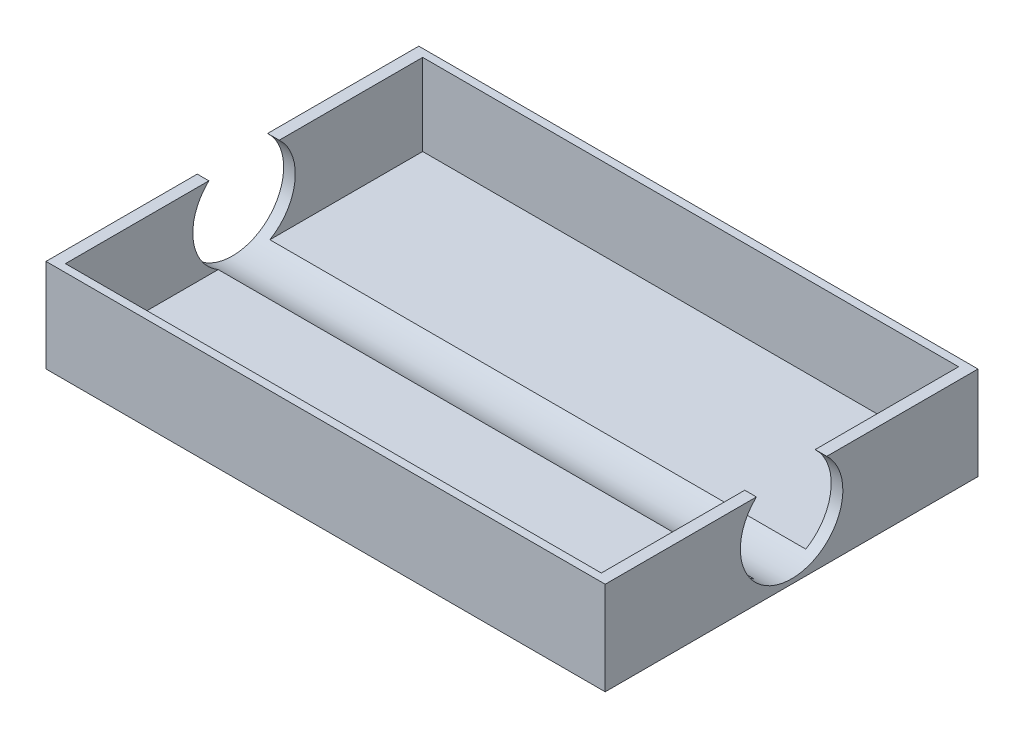
ISO-10303-21;
HEADER;
FILE_DESCRIPTION(('STEP AP214'),'2;1');
FILE_NAME('part.step','',(''),(''),'','','');
FILE_SCHEMA(('AUTOMOTIVE_DESIGN { 1 0 10303 214 1 1 1 1 }'));
ENDSEC;
DATA;
#1=APPLICATION_CONTEXT('core data for automotive mechanical design processes');
#2=APPLICATION_PROTOCOL_DEFINITION('international standard','automotive_design',2000,#1);
#3=PRODUCT_CONTEXT('',#1,'mechanical');
#4=PRODUCT('Part','Part','',(#3));
#5=PRODUCT_RELATED_PRODUCT_CATEGORY('part','',(#4));
#6=PRODUCT_DEFINITION_FORMATION('','',#4);
#7=PRODUCT_DEFINITION_CONTEXT('part definition',#1,'design');
#8=PRODUCT_DEFINITION('design','',#6,#7);
#9=PRODUCT_DEFINITION_SHAPE('','',#8);
#10=(LENGTH_UNIT() NAMED_UNIT(*) SI_UNIT(.MILLI.,.METRE.));
#11=(NAMED_UNIT(*) PLANE_ANGLE_UNIT() SI_UNIT($,.RADIAN.));
#12=(NAMED_UNIT(*) SI_UNIT($,.STERADIAN.) SOLID_ANGLE_UNIT());
#13=UNCERTAINTY_MEASURE_WITH_UNIT(LENGTH_MEASURE(1.E-05),#10,'distance_accuracy_value','');
#14=(GEOMETRIC_REPRESENTATION_CONTEXT(3) GLOBAL_UNCERTAINTY_ASSIGNED_CONTEXT((#13)) GLOBAL_UNIT_ASSIGNED_CONTEXT((#10,
#11,#12)) REPRESENTATION_CONTEXT('',''));
#15=CARTESIAN_POINT('',(0.,0.,0.));
#16=DIRECTION('',(0.,0.,1.));
#17=DIRECTION('',(1.,0.,0.));
#18=AXIS2_PLACEMENT_3D('',#15,#16,#17);
#19=CARTESIAN_POINT('',(0.,20.,0.));
#20=DIRECTION('',(0.,-1.,0.));
#21=DIRECTION('',(0.,0.,-1.));
#22=AXIS2_PLACEMENT_3D('',#19,#20,#21);
#23=PLANE('',#22);
#24=DIRECTION('',(0.,0.,-1.));
#25=VECTOR('',#24,1.);
#26=CARTESIAN_POINT('',(60.,20.,40.));
#27=LINE('',#26,#25);
#28=CARTESIAN_POINT('',(60.,20.,40.));
#29=VERTEX_POINT('',#28);
#30=CARTESIAN_POINT('',(60.,20.,7.54983443527075));
#31=VERTEX_POINT('',#30);
#32=EDGE_CURVE('E152',#29,#31,#27,.T.);
#33=ORIENTED_EDGE('',*,*,#32,.T.);
#34=DIRECTION('',(-1.,0.,0.));
#35=VECTOR('',#34,1.);
#36=CARTESIAN_POINT('',(60.,20.,7.54983443527075));
#37=LINE('',#36,#35);
#38=CARTESIAN_POINT('',(57.5,20.,7.54983443527075));
#39=VERTEX_POINT('',#38);
#40=EDGE_CURVE('E134',#31,#39,#37,.T.);
#41=ORIENTED_EDGE('',*,*,#40,.T.);
#42=DIRECTION('',(0.,0.,-1.));
#43=VECTOR('',#42,1.);
#44=CARTESIAN_POINT('',(57.5,20.,-38.3333333333333));
#45=LINE('',#44,#43);
#46=CARTESIAN_POINT('',(57.5,20.,38.3333333333333));
#47=VERTEX_POINT('',#46);
#48=EDGE_CURVE('E197',#47,#39,#45,.T.);
#49=ORIENTED_EDGE('',*,*,#48,.F.);
#50=DIRECTION('',(1.,0.,0.));
#51=VECTOR('',#50,1.);
#52=CARTESIAN_POINT('',(57.5,20.,38.3333333333333));
#53=LINE('',#52,#51);
#54=CARTESIAN_POINT('',(-57.5,20.,38.3333333333333));
#55=VERTEX_POINT('',#54);
#56=EDGE_CURVE('E212',#55,#47,#53,.T.);
#57=ORIENTED_EDGE('',*,*,#56,.F.);
#58=DIRECTION('',(0.,0.,1.));
#59=VECTOR('',#58,1.);
#60=CARTESIAN_POINT('',(-57.5,20.,-38.3333333333333));
#61=LINE('',#60,#59);
#62=CARTESIAN_POINT('',(-57.5,20.,7.54983443527075));
#63=VERTEX_POINT('',#62);
#64=EDGE_CURVE('E204',#63,#55,#61,.T.);
#65=ORIENTED_EDGE('',*,*,#64,.F.);
#66=CARTESIAN_POINT('',(-60.,20.,7.54983443527075));
#67=VERTEX_POINT('',#66);
#68=EDGE_CURVE('E146',#63,#67,#37,.T.);
#69=ORIENTED_EDGE('',*,*,#68,.T.);
#70=DIRECTION('',(0.,0.,1.));
#71=VECTOR('',#70,1.);
#72=CARTESIAN_POINT('',(-60.,20.,40.));
#73=LINE('',#72,#71);
#74=CARTESIAN_POINT('',(-60.,20.,40.));
#75=VERTEX_POINT('',#74);
#76=EDGE_CURVE('E162',#67,#75,#73,.T.);
#77=ORIENTED_EDGE('',*,*,#76,.T.);
#78=DIRECTION('',(1.,0.,0.));
#79=VECTOR('',#78,1.);
#80=CARTESIAN_POINT('',(-60.,20.,40.));
#81=LINE('',#80,#79);
#82=EDGE_CURVE('E158',#75,#29,#81,.T.);
#83=ORIENTED_EDGE('',*,*,#82,.T.);
#84=EDGE_LOOP('',(#33,#41,#49,#57,#65,#69,#77,#83));
#85=FACE_BOUND('',#84,.T.);
#86=ADVANCED_FACE('F35',(#85),#23,.F.);
#87=CARTESIAN_POINT('',(-57.5,20.,-38.3333333333333));
#88=DIRECTION('',(1.,0.,0.));
#89=DIRECTION('',(0.,0.,-1.));
#90=AXIS2_PLACEMENT_3D('',#87,#88,#89);
#91=PLANE('',#90);
#92=CARTESIAN_POINT('',(-57.5,12.,0.));
#93=DIRECTION('',(1.,0.,0.));
#94=DIRECTION('',(0.,0.,-1.));
#95=AXIS2_PLACEMENT_3D('',#92,#93,#94);
#96=CIRCLE('',#95,11.);
#97=CARTESIAN_POINT('',(-57.5,2.5,5.54526825320471));
#98=VERTEX_POINT('',#97);
#99=EDGE_CURVE('E50',#63,#98,#96,.T.);
#100=ORIENTED_EDGE('',*,*,#99,.F.);
#101=ORIENTED_EDGE('',*,*,#64,.T.);
#102=DIRECTION('',(0.,-1.,0.));
#103=VECTOR('',#102,1.);
#104=CARTESIAN_POINT('',(-57.5,20.,38.3333333333333));
#105=LINE('',#104,#103);
#106=CARTESIAN_POINT('',(-57.5,2.5,38.3333333333333));
#107=VERTEX_POINT('',#106);
#108=EDGE_CURVE('E166',#55,#107,#105,.T.);
#109=ORIENTED_EDGE('',*,*,#108,.T.);
#110=DIRECTION('',(0.,0.,1.));
#111=VECTOR('',#110,1.);
#112=CARTESIAN_POINT('',(-57.5,2.5,0.));
#113=LINE('',#112,#111);
#114=EDGE_CURVE('E57',#98,#107,#113,.T.);
#115=ORIENTED_EDGE('',*,*,#114,.F.);
#116=EDGE_LOOP('',(#100,#101,#109,#115));
#117=FACE_BOUND('',#116,.T.);
#118=ADVANCED_FACE('F227',(#117),#91,.T.);
#119=CARTESIAN_POINT('',(57.5,20.,-38.3333333333333));
#120=DIRECTION('',(-1.,0.,0.));
#121=DIRECTION('',(0.,0.,1.));
#122=AXIS2_PLACEMENT_3D('',#119,#120,#121);
#123=PLANE('',#122);
#124=CARTESIAN_POINT('',(57.5,12.,0.));
#125=DIRECTION('',(-1.,0.,0.));
#126=DIRECTION('',(0.,0.,1.));
#127=AXIS2_PLACEMENT_3D('',#124,#125,#126);
#128=CIRCLE('',#127,11.);
#129=CARTESIAN_POINT('',(57.5,20.,-7.54983443527075));
#130=VERTEX_POINT('',#129);
#131=CARTESIAN_POINT('',(57.5,2.5,-5.54526825320471));
#132=VERTEX_POINT('',#131);
#133=EDGE_CURVE('E145',#130,#132,#128,.T.);
#134=ORIENTED_EDGE('',*,*,#133,.F.);
#135=CARTESIAN_POINT('',(57.5,20.,-38.3333333333333));
#136=VERTEX_POINT('',#135);
#137=EDGE_CURVE('E214',#130,#136,#45,.T.);
#138=ORIENTED_EDGE('',*,*,#137,.T.);
#139=DIRECTION('',(0.,-1.,0.));
#140=VECTOR('',#139,1.);
#141=CARTESIAN_POINT('',(57.5,20.,-38.3333333333333));
#142=LINE('',#141,#140);
#143=CARTESIAN_POINT('',(57.5,2.5,-38.3333333333333));
#144=VERTEX_POINT('',#143);
#145=EDGE_CURVE('E220',#136,#144,#142,.T.);
#146=ORIENTED_EDGE('',*,*,#145,.T.);
#147=DIRECTION('',(0.,0.,1.));
#148=VECTOR('',#147,1.);
#149=CARTESIAN_POINT('',(57.5,2.5,0.));
#150=LINE('',#149,#148);
#151=EDGE_CURVE('E201',#144,#132,#150,.T.);
#152=ORIENTED_EDGE('',*,*,#151,.T.);
#153=EDGE_LOOP('',(#134,#138,#146,#152));
#154=FACE_BOUND('',#153,.T.);
#155=ADVANCED_FACE('F278',(#154),#123,.T.);
#156=CARTESIAN_POINT('',(0.,2.5,0.));
#157=DIRECTION('',(0.,1.,0.));
#158=DIRECTION('',(0.,0.,1.));
#159=AXIS2_PLACEMENT_3D('',#156,#157,#158);
#160=PLANE('',#159);
#161=DIRECTION('',(-1.,0.,0.));
#162=VECTOR('',#161,1.);
#163=CARTESIAN_POINT('',(60.,2.5,-5.54526825320471));
#164=LINE('',#163,#162);
#165=CARTESIAN_POINT('',(-57.5,2.5,-5.54526825320471));
#166=VERTEX_POINT('',#165);
#167=EDGE_CURVE('E11',#132,#166,#164,.T.);
#168=ORIENTED_EDGE('',*,*,#167,.F.);
#169=ORIENTED_EDGE('',*,*,#151,.F.);
#170=DIRECTION('',(-1.,0.,0.));
#171=VECTOR('',#170,1.);
#172=CARTESIAN_POINT('',(0.,2.5,-38.3333333333333));
#173=LINE('',#172,#171);
#174=CARTESIAN_POINT('',(-57.5,2.5,-38.3333333333333));
#175=VERTEX_POINT('',#174);
#176=EDGE_CURVE('E259',#144,#175,#173,.T.);
#177=ORIENTED_EDGE('',*,*,#176,.T.);
#178=EDGE_CURVE('E205',#175,#166,#113,.T.);
#179=ORIENTED_EDGE('',*,*,#178,.T.);
#180=EDGE_LOOP('',(#168,#169,#177,#179));
#181=FACE_BOUND('',#180,.T.);
#182=ADVANCED_FACE('F267',(#181),#160,.T.);
#183=CARTESIAN_POINT('',(-60.,20.,-40.));
#184=VERTEX_POINT('',#183);
#185=CARTESIAN_POINT('',(-60.,20.,-7.54983443527075));
#186=VERTEX_POINT('',#185);
#187=EDGE_CURVE('E169',#184,#186,#73,.T.);
#188=ORIENTED_EDGE('',*,*,#187,.T.);
#189=DIRECTION('',(-1.,0.,0.));
#190=VECTOR('',#189,1.);
#191=CARTESIAN_POINT('',(60.,20.,-7.54983443527075));
#192=LINE('',#191,#190);
#193=CARTESIAN_POINT('',(-57.5,20.,-7.54983443527075));
#194=VERTEX_POINT('',#193);
#195=EDGE_CURVE('E256',#186,#194,#192,.F.);
#196=ORIENTED_EDGE('',*,*,#195,.T.);
#197=CARTESIAN_POINT('',(-57.5,20.,-38.3333333333333));
#198=VERTEX_POINT('',#197);
#199=EDGE_CURVE('E209',#198,#194,#61,.T.);
#200=ORIENTED_EDGE('',*,*,#199,.F.);
#201=DIRECTION('',(-1.,0.,0.));
#202=VECTOR('',#201,1.);
#203=CARTESIAN_POINT('',(57.5,20.,-38.3333333333333));
#204=LINE('',#203,#202);
#205=EDGE_CURVE('E216',#136,#198,#204,.T.);
#206=ORIENTED_EDGE('',*,*,#205,.F.);
#207=ORIENTED_EDGE('',*,*,#137,.F.);
#208=CARTESIAN_POINT('',(60.,20.,-7.54983443527075));
#209=VERTEX_POINT('',#208);
#210=EDGE_CURVE('E253',#130,#209,#192,.F.);
#211=ORIENTED_EDGE('',*,*,#210,.T.);
#212=CARTESIAN_POINT('',(60.,20.,-40.));
#213=VERTEX_POINT('',#212);
#214=EDGE_CURVE('E154',#209,#213,#27,.T.);
#215=ORIENTED_EDGE('',*,*,#214,.T.);
#216=DIRECTION('',(-1.,0.,0.));
#217=VECTOR('',#216,1.);
#218=CARTESIAN_POINT('',(-60.,20.,-40.));
#219=LINE('',#218,#217);
#220=EDGE_CURVE('E160',#213,#184,#219,.T.);
#221=ORIENTED_EDGE('',*,*,#220,.T.);
#222=EDGE_LOOP('',(#188,#196,#200,#206,#207,#211,#215,#221));
#223=FACE_BOUND('',#222,.T.);
#224=ADVANCED_FACE('F250',(#223),#23,.F.);
#225=CARTESIAN_POINT('',(0.,0.,0.));
#226=DIRECTION('',(0.,-1.,0.));
#227=DIRECTION('',(0.,0.,-1.));
#228=AXIS2_PLACEMENT_3D('',#225,#226,#227);
#229=PLANE('',#228);
#230=DIRECTION('',(0.,0.,-1.));
#231=VECTOR('',#230,1.);
#232=CARTESIAN_POINT('',(60.,0.,40.));
#233=LINE('',#232,#231);
#234=CARTESIAN_POINT('',(60.,0.,40.));
#235=VERTEX_POINT('',#234);
#236=CARTESIAN_POINT('',(60.,0.,-40.));
#237=VERTEX_POINT('',#236);
#238=EDGE_CURVE('E174',#235,#237,#233,.T.);
#239=ORIENTED_EDGE('',*,*,#238,.F.);
#240=DIRECTION('',(1.,0.,0.));
#241=VECTOR('',#240,1.);
#242=CARTESIAN_POINT('',(-60.,0.,40.));
#243=LINE('',#242,#241);
#244=CARTESIAN_POINT('',(-60.,0.,40.));
#245=VERTEX_POINT('',#244);
#246=EDGE_CURVE('E164',#245,#235,#243,.T.);
#247=ORIENTED_EDGE('',*,*,#246,.F.);
#248=DIRECTION('',(0.,0.,1.));
#249=VECTOR('',#248,1.);
#250=CARTESIAN_POINT('',(-60.,0.,40.));
#251=LINE('',#250,#249);
#252=CARTESIAN_POINT('',(-60.,0.,-40.));
#253=VERTEX_POINT('',#252);
#254=EDGE_CURVE('E179',#253,#245,#251,.T.);
#255=ORIENTED_EDGE('',*,*,#254,.F.);
#256=DIRECTION('',(-1.,0.,0.));
#257=VECTOR('',#256,1.);
#258=CARTESIAN_POINT('',(-60.,0.,-40.));
#259=LINE('',#258,#257);
#260=EDGE_CURVE('E177',#237,#253,#259,.T.);
#261=ORIENTED_EDGE('',*,*,#260,.F.);
#262=EDGE_LOOP('',(#239,#247,#255,#261));
#263=FACE_BOUND('',#262,.T.);
#264=ADVANCED_FACE('F244',(#263),#229,.T.);
#265=CARTESIAN_POINT('',(60.,20.,40.));
#266=DIRECTION('',(-1.,0.,0.));
#267=DIRECTION('',(0.,0.,1.));
#268=AXIS2_PLACEMENT_3D('',#265,#266,#267);
#269=PLANE('',#268);
#270=ORIENTED_EDGE('',*,*,#214,.F.);
#271=CARTESIAN_POINT('',(60.,12.,0.));
#272=DIRECTION('',(-1.,0.,0.));
#273=DIRECTION('',(0.,0.,1.));
#274=AXIS2_PLACEMENT_3D('',#271,#272,#273);
#275=CIRCLE('',#274,11.);
#276=EDGE_CURVE('E137',#209,#31,#275,.T.);
#277=ORIENTED_EDGE('',*,*,#276,.T.);
#278=ORIENTED_EDGE('',*,*,#32,.F.);
#279=DIRECTION('',(0.,-1.,0.));
#280=VECTOR('',#279,1.);
#281=CARTESIAN_POINT('',(60.,20.,40.));
#282=LINE('',#281,#280);
#283=EDGE_CURVE('E173',#29,#235,#282,.T.);
#284=ORIENTED_EDGE('',*,*,#283,.T.);
#285=ORIENTED_EDGE('',*,*,#238,.T.);
#286=DIRECTION('',(0.,-1.,0.));
#287=VECTOR('',#286,1.);
#288=CARTESIAN_POINT('',(60.,20.,-40.));
#289=LINE('',#288,#287);
#290=EDGE_CURVE('E189',#213,#237,#289,.T.);
#291=ORIENTED_EDGE('',*,*,#290,.F.);
#292=EDGE_LOOP('',(#270,#277,#278,#284,#285,#291));
#293=FACE_BOUND('',#292,.T.);
#294=ADVANCED_FACE('F37',(#293),#269,.F.);
#295=CARTESIAN_POINT('',(-60.,20.,-40.));
#296=DIRECTION('',(0.,0.,1.));
#297=DIRECTION('',(1.,0.,0.));
#298=AXIS2_PLACEMENT_3D('',#295,#296,#297);
#299=PLANE('',#298);
#300=ORIENTED_EDGE('',*,*,#260,.T.);
#301=DIRECTION('',(0.,-1.,0.));
#302=VECTOR('',#301,1.);
#303=CARTESIAN_POINT('',(-60.,20.,-40.));
#304=LINE('',#303,#302);
#305=EDGE_CURVE('E186',#184,#253,#304,.T.);
#306=ORIENTED_EDGE('',*,*,#305,.F.);
#307=ORIENTED_EDGE('',*,*,#220,.F.);
#308=ORIENTED_EDGE('',*,*,#290,.T.);
#309=EDGE_LOOP('',(#300,#306,#307,#308));
#310=FACE_BOUND('',#309,.T.);
#311=ADVANCED_FACE('F248',(#310),#299,.F.);
#312=CARTESIAN_POINT('',(-60.,20.,40.));
#313=DIRECTION('',(1.,0.,0.));
#314=DIRECTION('',(0.,0.,-1.));
#315=AXIS2_PLACEMENT_3D('',#312,#313,#314);
#316=PLANE('',#315);
#317=ORIENTED_EDGE('',*,*,#76,.F.);
#318=CARTESIAN_POINT('',(-60.,12.,0.));
#319=DIRECTION('',(-1.,0.,0.));
#320=DIRECTION('',(0.,0.,1.));
#321=AXIS2_PLACEMENT_3D('',#318,#319,#320);
#322=CIRCLE('',#321,11.);
#323=EDGE_CURVE('E155',#186,#67,#322,.T.);
#324=ORIENTED_EDGE('',*,*,#323,.F.);
#325=ORIENTED_EDGE('',*,*,#187,.F.);
#326=ORIENTED_EDGE('',*,*,#305,.T.);
#327=ORIENTED_EDGE('',*,*,#254,.T.);
#328=DIRECTION('',(0.,-1.,0.));
#329=VECTOR('',#328,1.);
#330=CARTESIAN_POINT('',(-60.,20.,40.));
#331=LINE('',#330,#329);
#332=EDGE_CURVE('E183',#75,#245,#331,.T.);
#333=ORIENTED_EDGE('',*,*,#332,.F.);
#334=EDGE_LOOP('',(#317,#324,#325,#326,#327,#333));
#335=FACE_BOUND('',#334,.T.);
#336=ADVANCED_FACE('F236',(#335),#316,.F.);
#337=CARTESIAN_POINT('',(-60.,20.,40.));
#338=DIRECTION('',(0.,0.,-1.));
#339=DIRECTION('',(-1.,0.,0.));
#340=AXIS2_PLACEMENT_3D('',#337,#338,#339);
#341=PLANE('',#340);
#342=ORIENTED_EDGE('',*,*,#246,.T.);
#343=ORIENTED_EDGE('',*,*,#283,.F.);
#344=ORIENTED_EDGE('',*,*,#82,.F.);
#345=ORIENTED_EDGE('',*,*,#332,.T.);
#346=EDGE_LOOP('',(#342,#343,#344,#345));
#347=FACE_BOUND('',#346,.T.);
#348=ADVANCED_FACE('F241',(#347),#341,.F.);
#349=EDGE_CURVE('E257',#166,#194,#96,.T.);
#350=ORIENTED_EDGE('',*,*,#349,.F.);
#351=ORIENTED_EDGE('',*,*,#178,.F.);
#352=DIRECTION('',(0.,-1.,0.));
#353=VECTOR('',#352,1.);
#354=CARTESIAN_POINT('',(-57.5,20.,-38.3333333333333));
#355=LINE('',#354,#353);
#356=EDGE_CURVE('E218',#198,#175,#355,.T.);
#357=ORIENTED_EDGE('',*,*,#356,.F.);
#358=ORIENTED_EDGE('',*,*,#199,.T.);
#359=EDGE_LOOP('',(#350,#351,#357,#358));
#360=FACE_BOUND('',#359,.T.);
#361=ADVANCED_FACE('F272',(#360),#91,.T.);
#362=CARTESIAN_POINT('',(57.5,20.,38.3333333333333));
#363=DIRECTION('',(0.,0.,-1.));
#364=DIRECTION('',(-1.,0.,0.));
#365=AXIS2_PLACEMENT_3D('',#362,#363,#364);
#366=PLANE('',#365);
#367=DIRECTION('',(-1.,0.,0.));
#368=VECTOR('',#367,1.);
#369=CARTESIAN_POINT('',(0.,2.5,38.3333333333333));
#370=LINE('',#369,#368);
#371=CARTESIAN_POINT('',(57.5,2.5,38.3333333333333));
#372=VERTEX_POINT('',#371);
#373=EDGE_CURVE('E200',#372,#107,#370,.T.);
#374=ORIENTED_EDGE('',*,*,#373,.T.);
#375=ORIENTED_EDGE('',*,*,#108,.F.);
#376=ORIENTED_EDGE('',*,*,#56,.T.);
#377=DIRECTION('',(0.,-1.,0.));
#378=VECTOR('',#377,1.);
#379=CARTESIAN_POINT('',(57.5,20.,38.3333333333333));
#380=LINE('',#379,#378);
#381=EDGE_CURVE('E222',#47,#372,#380,.T.);
#382=ORIENTED_EDGE('',*,*,#381,.T.);
#383=EDGE_LOOP('',(#374,#375,#376,#382));
#384=FACE_BOUND('',#383,.T.);
#385=ADVANCED_FACE('F230',(#384),#366,.T.);
#386=CARTESIAN_POINT('',(57.5,2.5,5.54526825320471));
#387=VERTEX_POINT('',#386);
#388=EDGE_CURVE('E140',#387,#39,#128,.T.);
#389=ORIENTED_EDGE('',*,*,#388,.F.);
#390=EDGE_CURVE('E195',#387,#372,#150,.T.);
#391=ORIENTED_EDGE('',*,*,#390,.T.);
#392=ORIENTED_EDGE('',*,*,#381,.F.);
#393=ORIENTED_EDGE('',*,*,#48,.T.);
#394=EDGE_LOOP('',(#389,#391,#392,#393));
#395=FACE_BOUND('',#394,.T.);
#396=ADVANCED_FACE('F193',(#395),#123,.T.);
#397=CARTESIAN_POINT('',(57.5,20.,-38.3333333333333));
#398=DIRECTION('',(0.,0.,1.));
#399=DIRECTION('',(1.,0.,0.));
#400=AXIS2_PLACEMENT_3D('',#397,#398,#399);
#401=PLANE('',#400);
#402=ORIENTED_EDGE('',*,*,#176,.F.);
#403=ORIENTED_EDGE('',*,*,#145,.F.);
#404=ORIENTED_EDGE('',*,*,#205,.T.);
#405=ORIENTED_EDGE('',*,*,#356,.T.);
#406=EDGE_LOOP('',(#402,#403,#404,#405));
#407=FACE_BOUND('',#406,.T.);
#408=ADVANCED_FACE('F276',(#407),#401,.T.);
#409=DIRECTION('',(-1.,0.,0.));
#410=VECTOR('',#409,1.);
#411=CARTESIAN_POINT('',(60.,2.5,5.54526825320471));
#412=LINE('',#411,#410);
#413=EDGE_CURVE('E43',#98,#387,#412,.F.);
#414=ORIENTED_EDGE('',*,*,#413,.F.);
#415=ORIENTED_EDGE('',*,*,#114,.T.);
#416=ORIENTED_EDGE('',*,*,#373,.F.);
#417=ORIENTED_EDGE('',*,*,#390,.F.);
#418=EDGE_LOOP('',(#414,#415,#416,#417));
#419=FACE_BOUND('',#418,.T.);
#420=ADVANCED_FACE('F199',(#419),#160,.T.);
#421=CARTESIAN_POINT('',(60.,12.,0.));
#422=DIRECTION('',(-1.,0.,0.));
#423=DIRECTION('',(0.,0.,1.));
#424=AXIS2_PLACEMENT_3D('',#421,#422,#423);
#425=CYLINDRICAL_SURFACE('',#424,11.);
#426=ORIENTED_EDGE('',*,*,#323,.T.);
#427=ORIENTED_EDGE('',*,*,#68,.F.);
#428=ORIENTED_EDGE('',*,*,#99,.T.);
#429=ORIENTED_EDGE('',*,*,#413,.T.);
#430=ORIENTED_EDGE('',*,*,#388,.T.);
#431=ORIENTED_EDGE('',*,*,#40,.F.);
#432=ORIENTED_EDGE('',*,*,#276,.F.);
#433=ORIENTED_EDGE('',*,*,#210,.F.);
#434=ORIENTED_EDGE('',*,*,#133,.T.);
#435=ORIENTED_EDGE('',*,*,#167,.T.);
#436=ORIENTED_EDGE('',*,*,#349,.T.);
#437=ORIENTED_EDGE('',*,*,#195,.F.);
#438=EDGE_LOOP('',(#426,#427,#428,#429,#430,#431,#432,#433,#434,#435,#436,#437));
#439=FACE_BOUND('',#438,.T.);
#440=ADVANCED_FACE('F136',(#439),#425,.F.);
#441=CLOSED_SHELL('',(#86,#118,#155,#182,#224,#264,#294,#311,#336,#348,#361,#385,#396,#408,#420,#440));
#442=MANIFOLD_SOLID_BREP('B2',#441);
#443=ADVANCED_BREP_SHAPE_REPRESENTATION('',(#18,#442),#14);
#444=SHAPE_DEFINITION_REPRESENTATION(#9,#443);
ENDSEC;
END-ISO-10303-21;
